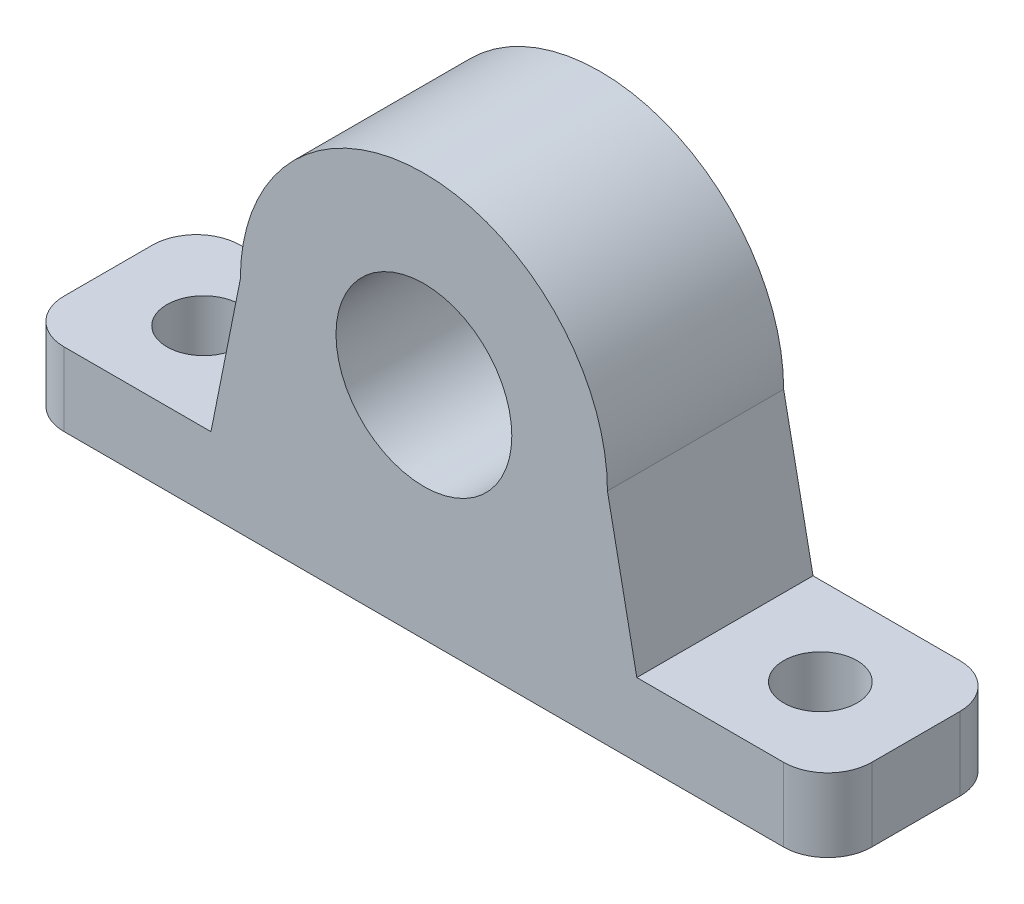
ISO-10303-21;
HEADER;
FILE_DESCRIPTION(('STEP AP214'),'2;1');
FILE_NAME('part.step','',(''),(''),'','','');
FILE_SCHEMA(('AUTOMOTIVE_DESIGN { 1 0 10303 214 1 1 1 1 }'));
ENDSEC;
DATA;
#1=APPLICATION_CONTEXT('core data for automotive mechanical design processes');
#2=APPLICATION_PROTOCOL_DEFINITION('international standard','automotive_design',2000,#1);
#3=PRODUCT_CONTEXT('',#1,'mechanical');
#4=PRODUCT('Part','Part','',(#3));
#5=PRODUCT_RELATED_PRODUCT_CATEGORY('part','',(#4));
#6=PRODUCT_DEFINITION_FORMATION('','',#4);
#7=PRODUCT_DEFINITION_CONTEXT('part definition',#1,'design');
#8=PRODUCT_DEFINITION('design','',#6,#7);
#9=PRODUCT_DEFINITION_SHAPE('','',#8);
#10=(LENGTH_UNIT() NAMED_UNIT(*) SI_UNIT(.MILLI.,.METRE.));
#11=(NAMED_UNIT(*) PLANE_ANGLE_UNIT() SI_UNIT($,.RADIAN.));
#12=(NAMED_UNIT(*) SI_UNIT($,.STERADIAN.) SOLID_ANGLE_UNIT());
#13=UNCERTAINTY_MEASURE_WITH_UNIT(LENGTH_MEASURE(1.E-05),#10,'distance_accuracy_value','');
#14=(GEOMETRIC_REPRESENTATION_CONTEXT(3) GLOBAL_UNCERTAINTY_ASSIGNED_CONTEXT((#13)) GLOBAL_UNIT_ASSIGNED_CONTEXT((#10,
#11,#12)) REPRESENTATION_CONTEXT('',''));
#15=CARTESIAN_POINT('',(0.,0.,0.));
#16=DIRECTION('',(0.,0.,1.));
#17=DIRECTION('',(1.,0.,0.));
#18=AXIS2_PLACEMENT_3D('',#15,#16,#17);
#19=CARTESIAN_POINT('',(27.5000000000001,15.,12.));
#20=DIRECTION('',(0.,0.,-1.));
#21=DIRECTION('',(-1.,0.,0.));
#22=AXIS2_PLACEMENT_3D('',#19,#20,#21);
#23=CYLINDRICAL_SURFACE('',#22,12.5);
#24=CARTESIAN_POINT('',(27.5000000000001,15.,0.));
#25=DIRECTION('',(0.,0.,1.));
#26=DIRECTION('',(1.,0.,0.));
#27=AXIS2_PLACEMENT_3D('',#24,#25,#26);
#28=CIRCLE('',#27,12.5);
#29=CARTESIAN_POINT('',(40.0000000000001,15.,0.));
#30=VERTEX_POINT('',#29);
#31=CARTESIAN_POINT('',(15.0000000000001,15.,0.));
#32=VERTEX_POINT('',#31);
#33=EDGE_CURVE('E146',#30,#32,#28,.T.);
#34=ORIENTED_EDGE('',*,*,#33,.T.);
#35=DIRECTION('',(0.,0.,-1.));
#36=VECTOR('',#35,1.);
#37=CARTESIAN_POINT('',(15.0000000000001,15.,12.));
#38=LINE('',#37,#36);
#39=CARTESIAN_POINT('',(15.0000000000001,15.,12.));
#40=VERTEX_POINT('',#39);
#41=EDGE_CURVE('E144',#40,#32,#38,.T.);
#42=ORIENTED_EDGE('',*,*,#41,.F.);
#43=CARTESIAN_POINT('',(27.5000000000001,15.,12.));
#44=DIRECTION('',(0.,0.,1.));
#45=DIRECTION('',(1.,0.,0.));
#46=AXIS2_PLACEMENT_3D('',#43,#44,#45);
#47=CIRCLE('',#46,12.5);
#48=CARTESIAN_POINT('',(40.0000000000001,15.,12.));
#49=VERTEX_POINT('',#48);
#50=EDGE_CURVE('E130',#49,#40,#47,.T.);
#51=ORIENTED_EDGE('',*,*,#50,.F.);
#52=DIRECTION('',(0.,0.,-1.));
#53=VECTOR('',#52,1.);
#54=CARTESIAN_POINT('',(40.0000000000001,15.,12.));
#55=LINE('',#54,#53);
#56=EDGE_CURVE('E171',#49,#30,#55,.T.);
#57=ORIENTED_EDGE('',*,*,#56,.T.);
#58=EDGE_LOOP('',(#34,#42,#51,#57));
#59=FACE_BOUND('',#58,.T.);
#60=ADVANCED_FACE('F39',(#59),#23,.T.);
#61=CARTESIAN_POINT('',(13.,4.99999999999999,12.));
#62=DIRECTION('',(-0.980580675690919,0.196116135138189,0.));
#63=DIRECTION('',(-0.196116135138189,-0.980580675690919,0.));
#64=AXIS2_PLACEMENT_3D('',#61,#62,#63);
#65=PLANE('',#64);
#66=DIRECTION('',(0.196116135138189,0.980580675690919,0.));
#67=VECTOR('',#66,1.);
#68=CARTESIAN_POINT('',(13.,4.99999999999999,0.));
#69=LINE('',#68,#67);
#70=CARTESIAN_POINT('',(13.,4.99999999999999,0.));
#71=VERTEX_POINT('',#70);
#72=EDGE_CURVE('E174',#71,#32,#69,.T.);
#73=ORIENTED_EDGE('',*,*,#72,.F.);
#74=DIRECTION('',(0.,0.,-1.));
#75=VECTOR('',#74,1.);
#76=CARTESIAN_POINT('',(13.,4.99999999999999,12.));
#77=LINE('',#76,#75);
#78=CARTESIAN_POINT('',(13.,4.99999999999999,12.));
#79=VERTEX_POINT('',#78);
#80=EDGE_CURVE('E152',#79,#71,#77,.T.);
#81=ORIENTED_EDGE('',*,*,#80,.F.);
#82=DIRECTION('',(0.196116135138189,0.980580675690919,0.));
#83=VECTOR('',#82,1.);
#84=CARTESIAN_POINT('',(13.,4.99999999999999,12.));
#85=LINE('',#84,#83);
#86=EDGE_CURVE('E136',#79,#40,#85,.T.);
#87=ORIENTED_EDGE('',*,*,#86,.T.);
#88=ORIENTED_EDGE('',*,*,#41,.T.);
#89=EDGE_LOOP('',(#73,#81,#87,#88));
#90=FACE_BOUND('',#89,.T.);
#91=ADVANCED_FACE('F154',(#90),#65,.T.);
#92=CARTESIAN_POINT('',(13.,4.99999999999999,12.));
#93=DIRECTION('',(0.,-1.,0.));
#94=DIRECTION('',(1.,0.,0.));
#95=AXIS2_PLACEMENT_3D('',#92,#93,#94);
#96=PLANE('',#95);
#97=CARTESIAN_POINT('',(6.5,4.99999999999999,6.));
#98=DIRECTION('',(0.,-1.,0.));
#99=DIRECTION('',(1.,0.,0.));
#100=AXIS2_PLACEMENT_3D('',#97,#98,#99);
#101=CIRCLE('',#100,2.5);
#102=CARTESIAN_POINT('',(6.5,4.99999999999999,3.5));
#103=VERTEX_POINT('',#102);
#104=EDGE_CURVE('E338',#103,#103,#101,.T.);
#105=ORIENTED_EDGE('',*,*,#104,.T.);
#106=EDGE_LOOP('',(#105));
#107=FACE_BOUND('',#106,.T.);
#108=DIRECTION('',(0.,0.,-1.));
#109=VECTOR('',#108,1.);
#110=CARTESIAN_POINT('',(0.,4.99999999999999,12.));
#111=LINE('',#110,#109);
#112=CARTESIAN_POINT('',(0.,4.99999999999999,9.));
#113=VERTEX_POINT('',#112);
#114=CARTESIAN_POINT('',(0.,4.99999999999999,3.));
#115=VERTEX_POINT('',#114);
#116=EDGE_CURVE('E209',#113,#115,#111,.T.);
#117=ORIENTED_EDGE('',*,*,#116,.F.);
#118=CARTESIAN_POINT('',(3.,4.99999999999999,9.));
#119=DIRECTION('',(0.,-1.,0.));
#120=DIRECTION('',(1.,0.,0.));
#121=AXIS2_PLACEMENT_3D('',#118,#119,#120);
#122=CIRCLE('',#121,3.);
#123=CARTESIAN_POINT('',(3.,4.99999999999999,12.));
#124=VERTEX_POINT('',#123);
#125=EDGE_CURVE('E11',#113,#124,#122,.F.);
#126=ORIENTED_EDGE('',*,*,#125,.T.);
#127=DIRECTION('',(-1.,0.,0.));
#128=VECTOR('',#127,1.);
#129=CARTESIAN_POINT('',(13.,4.99999999999999,12.));
#130=LINE('',#129,#128);
#131=EDGE_CURVE('E157',#79,#124,#130,.T.);
#132=ORIENTED_EDGE('',*,*,#131,.F.);
#133=ORIENTED_EDGE('',*,*,#80,.T.);
#134=DIRECTION('',(-1.,0.,0.));
#135=VECTOR('',#134,1.);
#136=CARTESIAN_POINT('',(13.,4.99999999999999,0.));
#137=LINE('',#136,#135);
#138=CARTESIAN_POINT('',(3.,4.99999999999999,0.));
#139=VERTEX_POINT('',#138);
#140=EDGE_CURVE('E178',#71,#139,#137,.T.);
#141=ORIENTED_EDGE('',*,*,#140,.T.);
#142=CARTESIAN_POINT('',(3.,4.99999999999999,3.));
#143=DIRECTION('',(0.,-1.,0.));
#144=DIRECTION('',(1.,0.,0.));
#145=AXIS2_PLACEMENT_3D('',#142,#143,#144);
#146=CIRCLE('',#145,3.);
#147=EDGE_CURVE('E48',#139,#115,#146,.F.);
#148=ORIENTED_EDGE('',*,*,#147,.T.);
#149=EDGE_LOOP('',(#117,#126,#132,#133,#141,#148));
#150=FACE_BOUND('',#149,.T.);
#151=ADVANCED_FACE('F270',(#107,#150),#96,.F.);
#152=CARTESIAN_POINT('',(0.,4.99999999999999,12.));
#153=DIRECTION('',(1.,0.,0.));
#154=DIRECTION('',(0.,0.,-1.));
#155=AXIS2_PLACEMENT_3D('',#152,#153,#154);
#156=PLANE('',#155);
#157=DIRECTION('',(0.,0.,-1.));
#158=VECTOR('',#157,1.);
#159=CARTESIAN_POINT('',(0.,0.,12.));
#160=LINE('',#159,#158);
#161=CARTESIAN_POINT('',(0.,0.,9.));
#162=VERTEX_POINT('',#161);
#163=CARTESIAN_POINT('',(0.,0.,3.));
#164=VERTEX_POINT('',#163);
#165=EDGE_CURVE('E205',#162,#164,#160,.T.);
#166=ORIENTED_EDGE('',*,*,#165,.F.);
#167=DIRECTION('',(0.,-1.,0.));
#168=VECTOR('',#167,1.);
#169=CARTESIAN_POINT('',(0.,4.99999999999999,9.));
#170=LINE('',#169,#168);
#171=EDGE_CURVE('E61',#162,#113,#170,.F.);
#172=ORIENTED_EDGE('',*,*,#171,.T.);
#173=ORIENTED_EDGE('',*,*,#116,.T.);
#174=DIRECTION('',(0.,-1.,0.));
#175=VECTOR('',#174,1.);
#176=CARTESIAN_POINT('',(0.,4.99999999999999,3.));
#177=LINE('',#176,#175);
#178=EDGE_CURVE('E252',#115,#164,#177,.T.);
#179=ORIENTED_EDGE('',*,*,#178,.T.);
#180=EDGE_LOOP('',(#166,#172,#173,#179));
#181=FACE_BOUND('',#180,.T.);
#182=ADVANCED_FACE('F259',(#181),#156,.F.);
#183=CARTESIAN_POINT('',(0.,0.,12.));
#184=DIRECTION('',(0.,1.,0.));
#185=DIRECTION('',(0.,0.,1.));
#186=AXIS2_PLACEMENT_3D('',#183,#184,#185);
#187=PLANE('',#186);
#188=CARTESIAN_POINT('',(6.5,0.,6.));
#189=DIRECTION('',(0.,1.,0.));
#190=DIRECTION('',(0.,0.,1.));
#191=AXIS2_PLACEMENT_3D('',#188,#189,#190);
#192=CIRCLE('',#191,2.5);
#193=CARTESIAN_POINT('',(6.5,0.,3.5));
#194=VERTEX_POINT('',#193);
#195=EDGE_CURVE('E342',#194,#194,#192,.T.);
#196=ORIENTED_EDGE('',*,*,#195,.T.);
#197=EDGE_LOOP('',(#196));
#198=FACE_BOUND('',#197,.T.);
#199=CARTESIAN_POINT('',(48.5,0.,6.));
#200=DIRECTION('',(0.,1.,0.));
#201=DIRECTION('',(0.,0.,1.));
#202=AXIS2_PLACEMENT_3D('',#199,#200,#201);
#203=CIRCLE('',#202,2.5);
#204=CARTESIAN_POINT('',(48.5,0.,3.5));
#205=VERTEX_POINT('',#204);
#206=EDGE_CURVE('E352',#205,#205,#203,.T.);
#207=ORIENTED_EDGE('',*,*,#206,.T.);
#208=EDGE_LOOP('',(#207));
#209=FACE_BOUND('',#208,.T.);
#210=DIRECTION('',(1.,0.,0.));
#211=VECTOR('',#210,1.);
#212=CARTESIAN_POINT('',(0.,0.,0.));
#213=LINE('',#212,#211);
#214=CARTESIAN_POINT('',(3.,0.,0.));
#215=VERTEX_POINT('',#214);
#216=CARTESIAN_POINT('',(52.,0.,0.));
#217=VERTEX_POINT('',#216);
#218=EDGE_CURVE('E181',#215,#217,#213,.T.);
#219=ORIENTED_EDGE('',*,*,#218,.T.);
#220=CARTESIAN_POINT('',(52.,0.,3.));
#221=DIRECTION('',(0.,1.,0.));
#222=DIRECTION('',(0.,0.,1.));
#223=AXIS2_PLACEMENT_3D('',#220,#221,#222);
#224=CIRCLE('',#223,3.);
#225=CARTESIAN_POINT('',(55.,0.,3.));
#226=VERTEX_POINT('',#225);
#227=EDGE_CURVE('E241',#217,#226,#224,.F.);
#228=ORIENTED_EDGE('',*,*,#227,.T.);
#229=DIRECTION('',(0.,0.,-1.));
#230=VECTOR('',#229,1.);
#231=CARTESIAN_POINT('',(55.,0.,12.));
#232=LINE('',#231,#230);
#233=CARTESIAN_POINT('',(55.,0.,9.));
#234=VERTEX_POINT('',#233);
#235=EDGE_CURVE('E201',#234,#226,#232,.T.);
#236=ORIENTED_EDGE('',*,*,#235,.F.);
#237=CARTESIAN_POINT('',(52.,0.,9.));
#238=DIRECTION('',(0.,1.,0.));
#239=DIRECTION('',(0.,0.,1.));
#240=AXIS2_PLACEMENT_3D('',#237,#238,#239);
#241=CIRCLE('',#240,3.);
#242=CARTESIAN_POINT('',(52.,0.,12.));
#243=VERTEX_POINT('',#242);
#244=EDGE_CURVE('E238',#234,#243,#241,.F.);
#245=ORIENTED_EDGE('',*,*,#244,.T.);
#246=DIRECTION('',(1.,0.,0.));
#247=VECTOR('',#246,1.);
#248=CARTESIAN_POINT('',(0.,0.,12.));
#249=LINE('',#248,#247);
#250=CARTESIAN_POINT('',(3.,0.,12.));
#251=VERTEX_POINT('',#250);
#252=EDGE_CURVE('E160',#251,#243,#249,.T.);
#253=ORIENTED_EDGE('',*,*,#252,.F.);
#254=CARTESIAN_POINT('',(3.,0.,9.));
#255=DIRECTION('',(0.,1.,0.));
#256=DIRECTION('',(0.,0.,1.));
#257=AXIS2_PLACEMENT_3D('',#254,#255,#256);
#258=CIRCLE('',#257,3.);
#259=EDGE_CURVE('E235',#251,#162,#258,.F.);
#260=ORIENTED_EDGE('',*,*,#259,.T.);
#261=ORIENTED_EDGE('',*,*,#165,.T.);
#262=CARTESIAN_POINT('',(3.,0.,3.));
#263=DIRECTION('',(0.,1.,0.));
#264=DIRECTION('',(0.,0.,1.));
#265=AXIS2_PLACEMENT_3D('',#262,#263,#264);
#266=CIRCLE('',#265,3.);
#267=EDGE_CURVE('E232',#164,#215,#266,.F.);
#268=ORIENTED_EDGE('',*,*,#267,.T.);
#269=EDGE_LOOP('',(#219,#228,#236,#245,#253,#260,#261,#268));
#270=FACE_BOUND('',#269,.T.);
#271=ADVANCED_FACE('F262',(#198,#209,#270),#187,.F.);
#272=CARTESIAN_POINT('',(55.,0.,12.));
#273=DIRECTION('',(-1.,0.,0.));
#274=DIRECTION('',(0.,0.,1.));
#275=AXIS2_PLACEMENT_3D('',#272,#273,#274);
#276=PLANE('',#275);
#277=ORIENTED_EDGE('',*,*,#235,.T.);
#278=DIRECTION('',(0.,1.,0.));
#279=VECTOR('',#278,1.);
#280=CARTESIAN_POINT('',(55.,0.,3.));
#281=LINE('',#280,#279);
#282=CARTESIAN_POINT('',(55.,5.,3.));
#283=VERTEX_POINT('',#282);
#284=EDGE_CURVE('E216',#226,#283,#281,.T.);
#285=ORIENTED_EDGE('',*,*,#284,.T.);
#286=DIRECTION('',(0.,0.,-1.));
#287=VECTOR('',#286,1.);
#288=CARTESIAN_POINT('',(55.,5.,12.));
#289=LINE('',#288,#287);
#290=CARTESIAN_POINT('',(55.,5.,9.));
#291=VERTEX_POINT('',#290);
#292=EDGE_CURVE('E197',#291,#283,#289,.T.);
#293=ORIENTED_EDGE('',*,*,#292,.F.);
#294=DIRECTION('',(0.,1.,0.));
#295=VECTOR('',#294,1.);
#296=CARTESIAN_POINT('',(55.,0.,9.));
#297=LINE('',#296,#295);
#298=EDGE_CURVE('E151',#291,#234,#297,.F.);
#299=ORIENTED_EDGE('',*,*,#298,.T.);
#300=EDGE_LOOP('',(#277,#285,#293,#299));
#301=FACE_BOUND('',#300,.T.);
#302=ADVANCED_FACE('F304',(#301),#276,.F.);
#303=CARTESIAN_POINT('',(55.,5.,12.));
#304=DIRECTION('',(0.,-1.,0.));
#305=DIRECTION('',(1.,0.,0.));
#306=AXIS2_PLACEMENT_3D('',#303,#304,#305);
#307=PLANE('',#306);
#308=CARTESIAN_POINT('',(48.5,5.,6.));
#309=DIRECTION('',(0.,-1.,0.));
#310=DIRECTION('',(1.,0.,0.));
#311=AXIS2_PLACEMENT_3D('',#308,#309,#310);
#312=CIRCLE('',#311,2.5);
#313=CARTESIAN_POINT('',(48.5,5.,3.5));
#314=VERTEX_POINT('',#313);
#315=EDGE_CURVE('E349',#314,#314,#312,.T.);
#316=ORIENTED_EDGE('',*,*,#315,.T.);
#317=EDGE_LOOP('',(#316));
#318=FACE_BOUND('',#317,.T.);
#319=ORIENTED_EDGE('',*,*,#292,.T.);
#320=CARTESIAN_POINT('',(52.,5.,3.));
#321=DIRECTION('',(0.,-1.,0.));
#322=DIRECTION('',(1.,0.,0.));
#323=AXIS2_PLACEMENT_3D('',#320,#321,#322);
#324=CIRCLE('',#323,3.);
#325=CARTESIAN_POINT('',(52.,5.,0.));
#326=VERTEX_POINT('',#325);
#327=EDGE_CURVE('E223',#283,#326,#324,.F.);
#328=ORIENTED_EDGE('',*,*,#327,.T.);
#329=DIRECTION('',(-1.,0.,0.));
#330=VECTOR('',#329,1.);
#331=CARTESIAN_POINT('',(55.,5.,0.));
#332=LINE('',#331,#330);
#333=CARTESIAN_POINT('',(42.,5.,0.));
#334=VERTEX_POINT('',#333);
#335=EDGE_CURVE('E185',#326,#334,#332,.T.);
#336=ORIENTED_EDGE('',*,*,#335,.T.);
#337=DIRECTION('',(0.,0.,-1.));
#338=VECTOR('',#337,1.);
#339=CARTESIAN_POINT('',(42.,5.,12.));
#340=LINE('',#339,#338);
#341=CARTESIAN_POINT('',(42.,5.,12.));
#342=VERTEX_POINT('',#341);
#343=EDGE_CURVE('E193',#342,#334,#340,.T.);
#344=ORIENTED_EDGE('',*,*,#343,.F.);
#345=DIRECTION('',(-1.,0.,0.));
#346=VECTOR('',#345,1.);
#347=CARTESIAN_POINT('',(55.,5.,12.));
#348=LINE('',#347,#346);
#349=CARTESIAN_POINT('',(52.,5.,12.));
#350=VERTEX_POINT('',#349);
#351=EDGE_CURVE('E166',#350,#342,#348,.T.);
#352=ORIENTED_EDGE('',*,*,#351,.F.);
#353=CARTESIAN_POINT('',(52.,5.,9.));
#354=DIRECTION('',(0.,-1.,0.));
#355=DIRECTION('',(1.,0.,0.));
#356=AXIS2_PLACEMENT_3D('',#353,#354,#355);
#357=CIRCLE('',#356,3.);
#358=EDGE_CURVE('E220',#350,#291,#357,.F.);
#359=ORIENTED_EDGE('',*,*,#358,.T.);
#360=EDGE_LOOP('',(#319,#328,#336,#344,#352,#359));
#361=FACE_BOUND('',#360,.T.);
#362=ADVANCED_FACE('F308',(#318,#361),#307,.F.);
#363=CARTESIAN_POINT('',(40.0000000000001,15.,12.));
#364=DIRECTION('',(0.980580675690921,0.196116135138178,0.));
#365=DIRECTION('',(-0.196116135138178,0.980580675690921,0.));
#366=AXIS2_PLACEMENT_3D('',#363,#364,#365);
#367=PLANE('',#366);
#368=DIRECTION('',(0.196116135138178,-0.980580675690921,0.));
#369=VECTOR('',#368,1.);
#370=CARTESIAN_POINT('',(40.0000000000001,15.,0.));
#371=LINE('',#370,#369);
#372=EDGE_CURVE('E141',#30,#334,#371,.T.);
#373=ORIENTED_EDGE('',*,*,#372,.F.);
#374=ORIENTED_EDGE('',*,*,#56,.F.);
#375=DIRECTION('',(0.196116135138178,-0.980580675690921,0.));
#376=VECTOR('',#375,1.);
#377=CARTESIAN_POINT('',(40.0000000000001,15.,12.));
#378=LINE('',#377,#376);
#379=EDGE_CURVE('E138',#49,#342,#378,.T.);
#380=ORIENTED_EDGE('',*,*,#379,.T.);
#381=ORIENTED_EDGE('',*,*,#343,.T.);
#382=EDGE_LOOP('',(#373,#374,#380,#381));
#383=FACE_BOUND('',#382,.T.);
#384=ADVANCED_FACE('F312',(#383),#367,.T.);
#385=CARTESIAN_POINT('',(27.5000000000001,15.,12.));
#386=DIRECTION('',(0.,0.,1.));
#387=DIRECTION('',(1.,0.,0.));
#388=AXIS2_PLACEMENT_3D('',#385,#386,#387);
#389=PLANE('',#388);
#390=CARTESIAN_POINT('',(27.5,15.,12.));
#391=DIRECTION('',(0.,0.,1.));
#392=DIRECTION('',(1.,0.,0.));
#393=AXIS2_PLACEMENT_3D('',#390,#391,#392);
#394=CIRCLE('',#393,5.98703107407983);
#395=CARTESIAN_POINT('',(33.4870310740798,15.,12.));
#396=VERTEX_POINT('',#395);
#397=EDGE_CURVE('E175',#396,#396,#394,.F.);
#398=ORIENTED_EDGE('',*,*,#397,.T.);
#399=EDGE_LOOP('',(#398));
#400=FACE_BOUND('',#399,.T.);
#401=ORIENTED_EDGE('',*,*,#252,.T.);
#402=DIRECTION('',(0.,1.,0.));
#403=VECTOR('',#402,1.);
#404=CARTESIAN_POINT('',(52.,5.,12.));
#405=LINE('',#404,#403);
#406=EDGE_CURVE('E248',#243,#350,#405,.T.);
#407=ORIENTED_EDGE('',*,*,#406,.T.);
#408=ORIENTED_EDGE('',*,*,#351,.T.);
#409=ORIENTED_EDGE('',*,*,#379,.F.);
#410=ORIENTED_EDGE('',*,*,#50,.T.);
#411=ORIENTED_EDGE('',*,*,#86,.F.);
#412=ORIENTED_EDGE('',*,*,#131,.T.);
#413=DIRECTION('',(0.,-1.,0.));
#414=VECTOR('',#413,1.);
#415=CARTESIAN_POINT('',(3.,0.,12.));
#416=LINE('',#415,#414);
#417=EDGE_CURVE('E244',#124,#251,#416,.T.);
#418=ORIENTED_EDGE('',*,*,#417,.T.);
#419=EDGE_LOOP('',(#401,#407,#408,#409,#410,#411,#412,#418));
#420=FACE_BOUND('',#419,.T.);
#421=ADVANCED_FACE('F133',(#400,#420),#389,.T.);
#422=CARTESIAN_POINT('',(27.5000000000001,15.,0.));
#423=DIRECTION('',(0.,0.,1.));
#424=DIRECTION('',(1.,0.,0.));
#425=AXIS2_PLACEMENT_3D('',#422,#423,#424);
#426=PLANE('',#425);
#427=CARTESIAN_POINT('',(27.5,15.,0.));
#428=DIRECTION('',(0.,0.,-1.));
#429=DIRECTION('',(-1.,0.,0.));
#430=AXIS2_PLACEMENT_3D('',#427,#428,#429);
#431=CIRCLE('',#430,5.98703107407983);
#432=CARTESIAN_POINT('',(21.5129689259202,15.,0.));
#433=VERTEX_POINT('',#432);
#434=EDGE_CURVE('E341',#433,#433,#431,.T.);
#435=ORIENTED_EDGE('',*,*,#434,.F.);
#436=EDGE_LOOP('',(#435));
#437=FACE_BOUND('',#436,.T.);
#438=ORIENTED_EDGE('',*,*,#335,.F.);
#439=DIRECTION('',(0.,1.,0.));
#440=VECTOR('',#439,1.);
#441=CARTESIAN_POINT('',(52.,15.,0.));
#442=LINE('',#441,#440);
#443=EDGE_CURVE('E229',#326,#217,#442,.F.);
#444=ORIENTED_EDGE('',*,*,#443,.T.);
#445=ORIENTED_EDGE('',*,*,#218,.F.);
#446=DIRECTION('',(0.,-1.,0.));
#447=VECTOR('',#446,1.);
#448=CARTESIAN_POINT('',(3.,15.,0.));
#449=LINE('',#448,#447);
#450=EDGE_CURVE('E226',#215,#139,#449,.F.);
#451=ORIENTED_EDGE('',*,*,#450,.T.);
#452=ORIENTED_EDGE('',*,*,#140,.F.);
#453=ORIENTED_EDGE('',*,*,#72,.T.);
#454=ORIENTED_EDGE('',*,*,#33,.F.);
#455=ORIENTED_EDGE('',*,*,#372,.T.);
#456=EDGE_LOOP('',(#438,#444,#445,#451,#452,#453,#454,#455));
#457=FACE_BOUND('',#456,.T.);
#458=ADVANCED_FACE('F274',(#437,#457),#426,.F.);
#459=CARTESIAN_POINT('',(27.5,15.,28.9338810866257));
#460=DIRECTION('',(0.,0.,-1.));
#461=DIRECTION('',(-1.,0.,0.));
#462=AXIS2_PLACEMENT_3D('',#459,#460,#461);
#463=CYLINDRICAL_SURFACE('',#462,5.98703107407983);
#464=ORIENTED_EDGE('',*,*,#434,.T.);
#465=EDGE_LOOP('',(#464));
#466=FACE_BOUND('',#465,.T.);
#467=ORIENTED_EDGE('',*,*,#397,.F.);
#468=EDGE_LOOP('',(#467));
#469=FACE_BOUND('',#468,.T.);
#470=ADVANCED_FACE('F362',(#466,#469),#463,.F.);
#471=CARTESIAN_POINT('',(48.5,12.0710678118655,6.));
#472=DIRECTION('',(0.,-1.,0.));
#473=DIRECTION('',(0.,0.,-1.));
#474=AXIS2_PLACEMENT_3D('',#471,#472,#473);
#475=CYLINDRICAL_SURFACE('',#474,2.5);
#476=CARTESIAN_POINT('',(48.5,5.,3.5));
#477=CARTESIAN_POINT('',(48.5,4.94791666666666,3.5));
#478=CARTESIAN_POINT('',(48.5,4.89583333333333,3.5));
#479=CARTESIAN_POINT('',(48.5,4.79166666666666,3.5));
#480=CARTESIAN_POINT('',(48.5,4.73958333333333,3.5));
#481=CARTESIAN_POINT('',(48.5,4.63541666666666,3.5));
#482=CARTESIAN_POINT('',(48.5,4.58333333333333,3.5));
#483=CARTESIAN_POINT('',(48.5,4.47916666666666,3.5));
#484=CARTESIAN_POINT('',(48.5,4.42708333333333,3.5));
#485=CARTESIAN_POINT('',(48.5,4.32291666666666,3.5));
#486=CARTESIAN_POINT('',(48.5,4.27083333333333,3.5));
#487=CARTESIAN_POINT('',(48.5,4.16666666666667,3.5));
#488=CARTESIAN_POINT('',(48.5,4.11458333333333,3.5));
#489=CARTESIAN_POINT('',(48.5,4.01041666666666,3.5));
#490=CARTESIAN_POINT('',(48.5,3.95833333333333,3.5));
#491=CARTESIAN_POINT('',(48.5,3.85416666666667,3.5));
#492=CARTESIAN_POINT('',(48.5,3.80208333333333,3.5));
#493=CARTESIAN_POINT('',(48.5,3.69791666666666,3.5));
#494=CARTESIAN_POINT('',(48.5,3.64583333333333,3.5));
#495=CARTESIAN_POINT('',(48.5,3.54166666666666,3.5));
#496=CARTESIAN_POINT('',(48.5,3.48958333333333,3.5));
#497=CARTESIAN_POINT('',(48.5,3.38541666666666,3.5));
#498=CARTESIAN_POINT('',(48.5,3.33333333333333,3.5));
#499=CARTESIAN_POINT('',(48.5,3.22916666666666,3.5));
#500=CARTESIAN_POINT('',(48.5,3.17708333333333,3.5));
#501=CARTESIAN_POINT('',(48.5,3.07291666666667,3.5));
#502=CARTESIAN_POINT('',(48.5,3.02083333333333,3.5));
#503=CARTESIAN_POINT('',(48.5,2.91666666666667,3.5));
#504=CARTESIAN_POINT('',(48.5,2.86458333333333,3.5));
#505=CARTESIAN_POINT('',(48.5,2.76041666666667,3.5));
#506=CARTESIAN_POINT('',(48.5,2.70833333333333,3.5));
#507=CARTESIAN_POINT('',(48.5,2.60416666666667,3.5));
#508=CARTESIAN_POINT('',(48.5,2.55208333333333,3.5));
#509=CARTESIAN_POINT('',(48.5,2.44791666666667,3.5));
#510=CARTESIAN_POINT('',(48.5,2.39583333333333,3.5));
#511=CARTESIAN_POINT('',(48.5,2.29166666666667,3.5));
#512=CARTESIAN_POINT('',(48.5,2.23958333333333,3.5));
#513=CARTESIAN_POINT('',(48.5,2.13541666666667,3.5));
#514=CARTESIAN_POINT('',(48.5,2.08333333333333,3.5));
#515=CARTESIAN_POINT('',(48.5,1.97916666666667,3.5));
#516=CARTESIAN_POINT('',(48.5,1.92708333333333,3.5));
#517=CARTESIAN_POINT('',(48.5,1.82291666666666,3.5));
#518=CARTESIAN_POINT('',(48.5,1.77083333333333,3.5));
#519=CARTESIAN_POINT('',(48.5,1.66666666666667,3.5));
#520=CARTESIAN_POINT('',(48.5,1.61458333333333,3.5));
#521=CARTESIAN_POINT('',(48.5,1.51041666666667,3.5));
#522=CARTESIAN_POINT('',(48.5,1.45833333333333,3.5));
#523=CARTESIAN_POINT('',(48.5,1.35416666666667,3.5));
#524=CARTESIAN_POINT('',(48.5,1.30208333333333,3.5));
#525=CARTESIAN_POINT('',(48.5,1.19791666666667,3.5));
#526=CARTESIAN_POINT('',(48.5,1.14583333333333,3.5));
#527=CARTESIAN_POINT('',(48.5,1.04166666666667,3.5));
#528=CARTESIAN_POINT('',(48.5,0.989583333333333,3.5));
#529=CARTESIAN_POINT('',(48.5,0.885416666666666,3.5));
#530=CARTESIAN_POINT('',(48.5,0.833333333333333,3.5));
#531=CARTESIAN_POINT('',(48.5,0.729166666666667,3.5));
#532=CARTESIAN_POINT('',(48.5,0.677083333333334,3.5));
#533=CARTESIAN_POINT('',(48.5,0.572916666666667,3.5));
#534=CARTESIAN_POINT('',(48.5,0.520833333333334,3.5));
#535=CARTESIAN_POINT('',(48.5,0.416666666666667,3.5));
#536=CARTESIAN_POINT('',(48.5,0.364583333333334,3.5));
#537=CARTESIAN_POINT('',(48.5,0.260416666666667,3.5));
#538=CARTESIAN_POINT('',(48.5,0.208333333333333,3.5));
#539=CARTESIAN_POINT('',(48.5,0.104166666666667,3.5));
#540=CARTESIAN_POINT('',(48.5,0.0520833333333334,3.5));
#541=CARTESIAN_POINT('',(48.5,0.,3.5));
#542=B_SPLINE_CURVE_WITH_KNOTS('',3,(#476,#477,#478,#479,#480,#481,#482,#483,#484,#485,#486,
#487,#488,#489,#490,#491,#492,#493,#494,#495,#496,#497,#498,#499,#500,#501,#502,#503,#504,#505,
#506,#507,#508,#509,#510,#511,#512,#513,#514,#515,#516,#517,#518,#519,#520,#521,#522,#523,#524,
#525,#526,#527,#528,#529,#530,#531,#532,#533,#534,#535,#536,#537,#538,#539,#540,#541),
.UNSPECIFIED.,.F.,.F.,(4,2,2,2,2,2,2,2,2,2,2,2,2,2,2,2,2,2,2,2,2,2,2,2,2,2,2,2,2,2,2,2,4),(0.,
0.15625,0.3125,0.46875,0.625,0.781249999999998,0.937499999999998,1.09375,1.25,1.40625,1.5625,
1.71875,1.875,2.03125,2.1875,2.34375,2.5,2.65625,2.8125,2.96875,3.125,3.28125,3.4375,3.59375,
3.75,3.90625,4.0625,4.21875,4.375,4.53125,4.6875,4.84375,5.),.UNSPECIFIED.);
#543=EDGE_CURVE('BSEAM364',#314,#205,#542,.T.);
#544=ORIENTED_EDGE('',*,*,#315,.F.);
#545=ORIENTED_EDGE('',*,*,#206,.F.);
#546=ORIENTED_EDGE('',*,*,#543,.T.);
#547=ORIENTED_EDGE('',*,*,#543,.F.);
#548=EDGE_LOOP('',(#544,#546,#545,#547));
#549=FACE_BOUND('',#548,.T.);
#550=ADVANCED_FACE('F364',(#549),#475,.F.);
#551=CARTESIAN_POINT('',(6.5,12.0710678118655,6.));
#552=DIRECTION('',(0.,-1.,0.));
#553=DIRECTION('',(0.,0.,-1.));
#554=AXIS2_PLACEMENT_3D('',#551,#552,#553);
#555=CYLINDRICAL_SURFACE('',#554,2.5);
#556=CARTESIAN_POINT('',(6.5,4.99999999999999,3.5));
#557=CARTESIAN_POINT('',(6.5,4.94791666666666,3.5));
#558=CARTESIAN_POINT('',(6.5,4.89583333333333,3.5));
#559=CARTESIAN_POINT('',(6.5,4.79166666666666,3.5));
#560=CARTESIAN_POINT('',(6.5,4.73958333333333,3.5));
#561=CARTESIAN_POINT('',(6.5,4.63541666666666,3.5));
#562=CARTESIAN_POINT('',(6.5,4.58333333333333,3.5));
#563=CARTESIAN_POINT('',(6.5,4.47916666666666,3.5));
#564=CARTESIAN_POINT('',(6.5,4.42708333333333,3.5));
#565=CARTESIAN_POINT('',(6.5,4.32291666666666,3.5));
#566=CARTESIAN_POINT('',(6.5,4.27083333333333,3.5));
#567=CARTESIAN_POINT('',(6.5,4.16666666666666,3.5));
#568=CARTESIAN_POINT('',(6.5,4.11458333333333,3.5));
#569=CARTESIAN_POINT('',(6.5,4.01041666666666,3.5));
#570=CARTESIAN_POINT('',(6.5,3.95833333333333,3.5));
#571=CARTESIAN_POINT('',(6.5,3.85416666666666,3.5));
#572=CARTESIAN_POINT('',(6.5,3.80208333333333,3.5));
#573=CARTESIAN_POINT('',(6.5,3.69791666666666,3.5));
#574=CARTESIAN_POINT('',(6.5,3.64583333333333,3.5));
#575=CARTESIAN_POINT('',(6.5,3.54166666666666,3.5));
#576=CARTESIAN_POINT('',(6.5,3.48958333333333,3.5));
#577=CARTESIAN_POINT('',(6.5,3.38541666666666,3.5));
#578=CARTESIAN_POINT('',(6.5,3.33333333333333,3.5));
#579=CARTESIAN_POINT('',(6.5,3.22916666666666,3.5));
#580=CARTESIAN_POINT('',(6.5,3.17708333333333,3.5));
#581=CARTESIAN_POINT('',(6.5,3.07291666666666,3.5));
#582=CARTESIAN_POINT('',(6.5,3.02083333333333,3.5));
#583=CARTESIAN_POINT('',(6.5,2.91666666666666,3.5));
#584=CARTESIAN_POINT('',(6.5,2.86458333333333,3.5));
#585=CARTESIAN_POINT('',(6.5,2.76041666666666,3.5));
#586=CARTESIAN_POINT('',(6.5,2.70833333333333,3.5));
#587=CARTESIAN_POINT('',(6.5,2.60416666666666,3.5));
#588=CARTESIAN_POINT('',(6.5,2.55208333333333,3.5));
#589=CARTESIAN_POINT('',(6.5,2.44791666666666,3.5));
#590=CARTESIAN_POINT('',(6.5,2.39583333333333,3.5));
#591=CARTESIAN_POINT('',(6.5,2.29166666666666,3.5));
#592=CARTESIAN_POINT('',(6.5,2.23958333333333,3.5));
#593=CARTESIAN_POINT('',(6.5,2.13541666666666,3.5));
#594=CARTESIAN_POINT('',(6.5,2.08333333333333,3.5));
#595=CARTESIAN_POINT('',(6.5,1.97916666666666,3.5));
#596=CARTESIAN_POINT('',(6.5,1.92708333333333,3.5));
#597=CARTESIAN_POINT('',(6.5,1.82291666666666,3.5));
#598=CARTESIAN_POINT('',(6.5,1.77083333333333,3.5));
#599=CARTESIAN_POINT('',(6.5,1.66666666666666,3.5));
#600=CARTESIAN_POINT('',(6.5,1.61458333333333,3.5));
#601=CARTESIAN_POINT('',(6.5,1.51041666666666,3.5));
#602=CARTESIAN_POINT('',(6.5,1.45833333333333,3.5));
#603=CARTESIAN_POINT('',(6.5,1.35416666666666,3.5));
#604=CARTESIAN_POINT('',(6.5,1.30208333333333,3.5));
#605=CARTESIAN_POINT('',(6.5,1.19791666666666,3.5));
#606=CARTESIAN_POINT('',(6.5,1.14583333333333,3.5));
#607=CARTESIAN_POINT('',(6.5,1.04166666666666,3.5));
#608=CARTESIAN_POINT('',(6.5,0.989583333333331,3.5));
#609=CARTESIAN_POINT('',(6.5,0.885416666666665,3.5));
#610=CARTESIAN_POINT('',(6.5,0.833333333333332,3.5));
#611=CARTESIAN_POINT('',(6.5,0.729166666666666,3.5));
#612=CARTESIAN_POINT('',(6.5,0.677083333333332,3.5));
#613=CARTESIAN_POINT('',(6.5,0.572916666666666,3.5));
#614=CARTESIAN_POINT('',(6.5,0.520833333333333,3.5));
#615=CARTESIAN_POINT('',(6.5,0.416666666666667,3.5));
#616=CARTESIAN_POINT('',(6.5,0.364583333333334,3.5));
#617=CARTESIAN_POINT('',(6.5,0.260416666666667,3.5));
#618=CARTESIAN_POINT('',(6.5,0.208333333333333,3.5));
#619=CARTESIAN_POINT('',(6.5,0.104166666666667,3.5));
#620=CARTESIAN_POINT('',(6.5,0.0520833333333334,3.5));
#621=CARTESIAN_POINT('',(6.5,0.,3.5));
#622=B_SPLINE_CURVE_WITH_KNOTS('',3,(#556,#557,#558,#559,#560,#561,#562,#563,#564,#565,#566,
#567,#568,#569,#570,#571,#572,#573,#574,#575,#576,#577,#578,#579,#580,#581,#582,#583,#584,#585,
#586,#587,#588,#589,#590,#591,#592,#593,#594,#595,#596,#597,#598,#599,#600,#601,#602,#603,#604,
#605,#606,#607,#608,#609,#610,#611,#612,#613,#614,#615,#616,#617,#618,#619,#620,#621),
.UNSPECIFIED.,.F.,.F.,(4,2,2,2,2,2,2,2,2,2,2,2,2,2,2,2,2,2,2,2,2,2,2,2,2,2,2,2,2,2,2,2,4),(0.,
0.15625,0.312499999999999,0.46875,0.624999999999999,0.781249999999998,0.937499999999998,1.09375,
1.25,1.40625,1.5625,1.71875,1.875,2.03125,2.1875,2.34375,2.5,2.65624999999999,2.81249999999999,
2.96874999999999,3.12499999999999,3.28124999999999,3.43749999999999,3.59374999999999,
3.74999999999999,3.90624999999999,4.06249999999999,4.21874999999999,4.37499999999999,
4.53124999999999,4.68749999999999,4.84374999999999,4.99999999999999),.UNSPECIFIED.);
#623=EDGE_CURVE('BSEAM292',#103,#194,#622,.T.);
#624=ORIENTED_EDGE('',*,*,#104,.F.);
#625=ORIENTED_EDGE('',*,*,#195,.F.);
#626=ORIENTED_EDGE('',*,*,#623,.T.);
#627=ORIENTED_EDGE('',*,*,#623,.F.);
#628=EDGE_LOOP('',(#624,#626,#625,#627));
#629=FACE_BOUND('',#628,.T.);
#630=ADVANCED_FACE('F292',(#629),#555,.F.);
#631=CARTESIAN_POINT('',(52.,0.,3.));
#632=DIRECTION('',(0.,1.,0.));
#633=DIRECTION('',(0.,0.,1.));
#634=AXIS2_PLACEMENT_3D('',#631,#632,#633);
#635=CYLINDRICAL_SURFACE('',#634,3.);
#636=ORIENTED_EDGE('',*,*,#227,.F.);
#637=ORIENTED_EDGE('',*,*,#443,.F.);
#638=ORIENTED_EDGE('',*,*,#327,.F.);
#639=ORIENTED_EDGE('',*,*,#284,.F.);
#640=EDGE_LOOP('',(#636,#637,#638,#639));
#641=FACE_BOUND('',#640,.T.);
#642=ADVANCED_FACE('F289',(#641),#635,.T.);
#643=CARTESIAN_POINT('',(52.,15.,9.));
#644=DIRECTION('',(0.,-1.,0.));
#645=DIRECTION('',(0.,0.,-1.));
#646=AXIS2_PLACEMENT_3D('',#643,#644,#645);
#647=CYLINDRICAL_SURFACE('',#646,3.);
#648=ORIENTED_EDGE('',*,*,#244,.F.);
#649=ORIENTED_EDGE('',*,*,#298,.F.);
#650=ORIENTED_EDGE('',*,*,#358,.F.);
#651=ORIENTED_EDGE('',*,*,#406,.F.);
#652=EDGE_LOOP('',(#648,#649,#650,#651));
#653=FACE_BOUND('',#652,.T.);
#654=ADVANCED_FACE('F280',(#653),#647,.T.);
#655=CARTESIAN_POINT('',(3.,15.,9.));
#656=DIRECTION('',(0.,1.,0.));
#657=DIRECTION('',(0.,0.,1.));
#658=AXIS2_PLACEMENT_3D('',#655,#656,#657);
#659=CYLINDRICAL_SURFACE('',#658,3.);
#660=ORIENTED_EDGE('',*,*,#125,.F.);
#661=ORIENTED_EDGE('',*,*,#171,.F.);
#662=ORIENTED_EDGE('',*,*,#259,.F.);
#663=ORIENTED_EDGE('',*,*,#417,.F.);
#664=EDGE_LOOP('',(#660,#661,#662,#663));
#665=FACE_BOUND('',#664,.T.);
#666=ADVANCED_FACE('F268',(#665),#659,.T.);
#667=CARTESIAN_POINT('',(3.,4.99999999999999,3.));
#668=DIRECTION('',(0.,-1.,0.));
#669=DIRECTION('',(0.,0.,-1.));
#670=AXIS2_PLACEMENT_3D('',#667,#668,#669);
#671=CYLINDRICAL_SURFACE('',#670,3.);
#672=ORIENTED_EDGE('',*,*,#147,.F.);
#673=ORIENTED_EDGE('',*,*,#450,.F.);
#674=ORIENTED_EDGE('',*,*,#267,.F.);
#675=ORIENTED_EDGE('',*,*,#178,.F.);
#676=EDGE_LOOP('',(#672,#673,#674,#675));
#677=FACE_BOUND('',#676,.T.);
#678=ADVANCED_FACE('F41',(#677),#671,.T.);
#679=CLOSED_SHELL('',(#60,#91,#151,#182,#271,#302,#362,#384,#421,#458,#470,#550,#630,#642,#654,
#666,#678));
#680=MANIFOLD_SOLID_BREP('B2',#679);
#681=ADVANCED_BREP_SHAPE_REPRESENTATION('',(#18,#680),#14);
#682=SHAPE_DEFINITION_REPRESENTATION(#9,#681);
ENDSEC;
END-ISO-10303-21;
